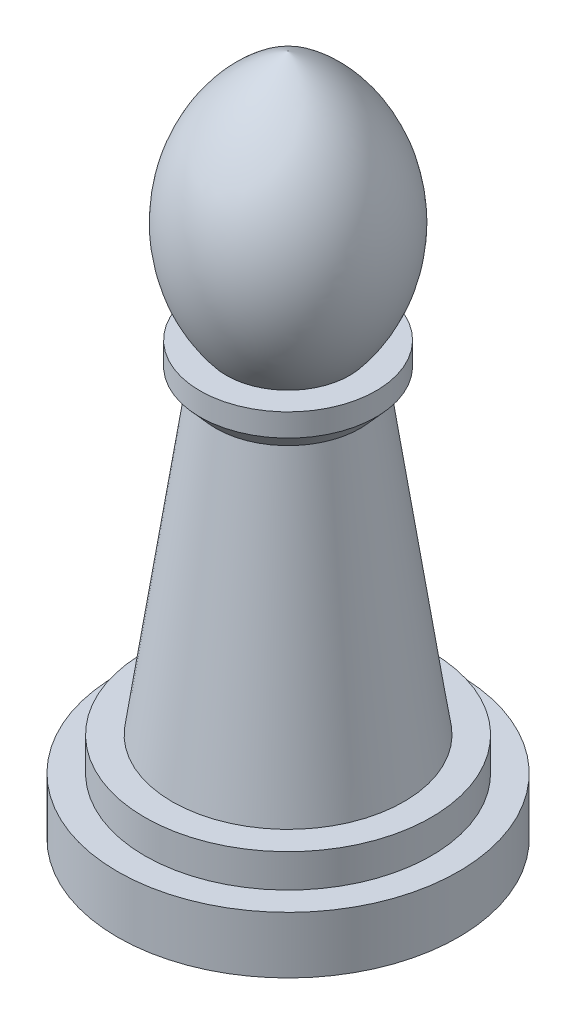
ISO-10303-21;
HEADER;
FILE_DESCRIPTION(('STEP AP214'),'2;1');
FILE_NAME('part.step','',(''),(''),'','','');
FILE_SCHEMA(('AUTOMOTIVE_DESIGN { 1 0 10303 214 1 1 1 1 }'));
ENDSEC;
DATA;
#1=APPLICATION_CONTEXT('core data for automotive mechanical design processes');
#2=APPLICATION_PROTOCOL_DEFINITION('international standard','automotive_design',2000,#1);
#3=PRODUCT_CONTEXT('',#1,'mechanical');
#4=PRODUCT('Part','Part','',(#3));
#5=PRODUCT_RELATED_PRODUCT_CATEGORY('part','',(#4));
#6=PRODUCT_DEFINITION_FORMATION('','',#4);
#7=PRODUCT_DEFINITION_CONTEXT('part definition',#1,'design');
#8=PRODUCT_DEFINITION('design','',#6,#7);
#9=PRODUCT_DEFINITION_SHAPE('','',#8);
#10=(LENGTH_UNIT() NAMED_UNIT(*) SI_UNIT(.MILLI.,.METRE.));
#11=(NAMED_UNIT(*) PLANE_ANGLE_UNIT() SI_UNIT($,.RADIAN.));
#12=(NAMED_UNIT(*) SI_UNIT($,.STERADIAN.) SOLID_ANGLE_UNIT());
#13=UNCERTAINTY_MEASURE_WITH_UNIT(LENGTH_MEASURE(1.E-05),#10,'distance_accuracy_value','');
#14=(GEOMETRIC_REPRESENTATION_CONTEXT(3) GLOBAL_UNCERTAINTY_ASSIGNED_CONTEXT((#13)) GLOBAL_UNIT_ASSIGNED_CONTEXT((#10,
#11,#12)) REPRESENTATION_CONTEXT('',''));
#15=CARTESIAN_POINT('',(0.,0.,0.));
#16=DIRECTION('',(0.,0.,1.));
#17=DIRECTION('',(1.,0.,0.));
#18=AXIS2_PLACEMENT_3D('',#15,#16,#17);
#19=CARTESIAN_POINT('',(0.,0.,0.));
#20=DIRECTION('',(0.,-1.,0.));
#21=DIRECTION('',(0.,0.,-1.));
#22=AXIS2_PLACEMENT_3D('',#19,#20,#21);
#23=PLANE('',#22);
#24=CARTESIAN_POINT('',(0.,0.,0.));
#25=DIRECTION('',(0.,1.,0.));
#26=DIRECTION('',(0.,0.,1.));
#27=AXIS2_PLACEMENT_3D('',#24,#25,#26);
#28=CIRCLE('',#27,9.525);
#29=CARTESIAN_POINT('',(0.,0.,9.525));
#30=VERTEX_POINT('',#29);
#31=EDGE_CURVE('E11',#30,#30,#28,.T.);
#32=ORIENTED_EDGE('',*,*,#31,.F.);
#33=EDGE_LOOP('',(#32));
#34=FACE_BOUND('',#33,.T.);
#35=ADVANCED_FACE('F43',(#34),#23,.T.);
#36=CARTESIAN_POINT('',(0.,38.1,0.));
#37=DIRECTION('',(0.,1.,0.));
#38=DIRECTION('',(0.,0.,1.));
#39=AXIS2_PLACEMENT_3D('',#36,#37,#38);
#40=CYLINDRICAL_SURFACE('',#39,9.525);
#41=ORIENTED_EDGE('',*,*,#31,.T.);
#42=EDGE_LOOP('',(#41));
#43=FACE_BOUND('',#42,.T.);
#44=CARTESIAN_POINT('',(0.,3.175,0.));
#45=DIRECTION('',(0.,1.,0.));
#46=DIRECTION('',(0.,0.,1.));
#47=AXIS2_PLACEMENT_3D('',#44,#45,#46);
#48=CIRCLE('',#47,9.525);
#49=CARTESIAN_POINT('',(0.,3.175,9.525));
#50=VERTEX_POINT('',#49);
#51=EDGE_CURVE('E49',#50,#50,#48,.T.);
#52=ORIENTED_EDGE('',*,*,#51,.F.);
#53=EDGE_LOOP('',(#52));
#54=FACE_BOUND('',#53,.T.);
#55=ADVANCED_FACE('F65',(#43,#54),#40,.T.);
#56=CARTESIAN_POINT('',(-8.001,3.175,0.));
#57=DIRECTION('',(0.,1.,0.));
#58=DIRECTION('',(0.,0.,1.));
#59=AXIS2_PLACEMENT_3D('',#56,#57,#58);
#60=PLANE('',#59);
#61=ORIENTED_EDGE('',*,*,#51,.T.);
#62=EDGE_LOOP('',(#61));
#63=FACE_BOUND('',#62,.T.);
#64=CARTESIAN_POINT('',(0.,3.175,0.));
#65=DIRECTION('',(0.,1.,0.));
#66=DIRECTION('',(0.,0.,1.));
#67=AXIS2_PLACEMENT_3D('',#64,#65,#66);
#68=CIRCLE('',#67,8.001);
#69=CARTESIAN_POINT('',(0.,3.175,8.001));
#70=VERTEX_POINT('',#69);
#71=EDGE_CURVE('E77',#70,#70,#68,.T.);
#72=ORIENTED_EDGE('',*,*,#71,.F.);
#73=EDGE_LOOP('',(#72));
#74=FACE_BOUND('',#73,.T.);
#75=ADVANCED_FACE('F70',(#63,#74),#60,.T.);
#76=CARTESIAN_POINT('',(0.,38.1,0.));
#77=DIRECTION('',(0.,1.,0.));
#78=DIRECTION('',(0.,0.,1.));
#79=AXIS2_PLACEMENT_3D('',#76,#77,#78);
#80=CYLINDRICAL_SURFACE('',#79,8.001);
#81=ORIENTED_EDGE('',*,*,#71,.T.);
#82=EDGE_LOOP('',(#81));
#83=FACE_BOUND('',#82,.T.);
#84=CARTESIAN_POINT('',(0.,5.03366229278283,0.));
#85=DIRECTION('',(0.,1.,0.));
#86=DIRECTION('',(0.,0.,1.));
#87=AXIS2_PLACEMENT_3D('',#84,#85,#86);
#88=CIRCLE('',#87,8.001);
#89=CARTESIAN_POINT('',(0.,5.03366229278283,8.001));
#90=VERTEX_POINT('',#89);
#91=EDGE_CURVE('E79',#90,#90,#88,.T.);
#92=ORIENTED_EDGE('',*,*,#91,.F.);
#93=EDGE_LOOP('',(#92));
#94=FACE_BOUND('',#93,.T.);
#95=ADVANCED_FACE('F118',(#83,#94),#80,.T.);
#96=CARTESIAN_POINT('',(-6.477,5.03366229278283,0.));
#97=DIRECTION('',(0.,1.,0.));
#98=DIRECTION('',(0.,0.,1.));
#99=AXIS2_PLACEMENT_3D('',#96,#97,#98);
#100=PLANE('',#99);
#101=ORIENTED_EDGE('',*,*,#91,.T.);
#102=EDGE_LOOP('',(#101));
#103=FACE_BOUND('',#102,.T.);
#104=CARTESIAN_POINT('',(0.,5.03366229278283,0.));
#105=DIRECTION('',(0.,1.,0.));
#106=DIRECTION('',(0.,0.,1.));
#107=AXIS2_PLACEMENT_3D('',#104,#105,#106);
#108=CIRCLE('',#107,6.477);
#109=CARTESIAN_POINT('',(0.,5.03366229278283,6.477));
#110=VERTEX_POINT('',#109);
#111=EDGE_CURVE('E84',#110,#110,#108,.T.);
#112=ORIENTED_EDGE('',*,*,#111,.F.);
#113=EDGE_LOOP('',(#112));
#114=FACE_BOUND('',#113,.T.);
#115=ADVANCED_FACE('F114',(#103,#114),#100,.T.);
#116=CARTESIAN_POINT('',(0.,21.8738622927828,0.));
#117=DIRECTION('',(0.,-1.,0.));
#118=DIRECTION('',(0.,0.,-1.));
#119=AXIS2_PLACEMENT_3D('',#116,#117,#118);
#120=CONICAL_SURFACE('',#119,4.0386,0.143796988986842);
#121=ORIENTED_EDGE('',*,*,#111,.T.);
#122=EDGE_LOOP('',(#121));
#123=FACE_BOUND('',#122,.T.);
#124=CARTESIAN_POINT('',(0.,21.8738622927828,0.));
#125=DIRECTION('',(0.,1.,0.));
#126=DIRECTION('',(0.,0.,1.));
#127=AXIS2_PLACEMENT_3D('',#124,#125,#126);
#128=CIRCLE('',#127,4.0386);
#129=CARTESIAN_POINT('',(0.,21.8738622927828,4.0386));
#130=VERTEX_POINT('',#129);
#131=EDGE_CURVE('E87',#130,#130,#128,.T.);
#132=ORIENTED_EDGE('',*,*,#131,.F.);
#133=EDGE_LOOP('',(#132));
#134=FACE_BOUND('',#133,.T.);
#135=ADVANCED_FACE('F108',(#123,#134),#120,.T.);
#136=CARTESIAN_POINT('',(0.,22.86,0.));
#137=DIRECTION('',(0.,1.,0.));
#138=DIRECTION('',(0.,0.,1.));
#139=AXIS2_PLACEMENT_3D('',#136,#137,#138);
#140=CONICAL_SURFACE('',#139,4.91910297712495,0.728867637010325);
#141=ORIENTED_EDGE('',*,*,#131,.T.);
#142=EDGE_LOOP('',(#141));
#143=FACE_BOUND('',#142,.T.);
#144=CARTESIAN_POINT('',(0.,22.86,0.));
#145=DIRECTION('',(0.,1.,0.));
#146=DIRECTION('',(0.,0.,1.));
#147=AXIS2_PLACEMENT_3D('',#144,#145,#146);
#148=CIRCLE('',#147,4.91910297712495);
#149=CARTESIAN_POINT('',(0.,22.86,4.91910297712495));
#150=VERTEX_POINT('',#149);
#151=EDGE_CURVE('E90',#150,#150,#148,.T.);
#152=ORIENTED_EDGE('',*,*,#151,.F.);
#153=EDGE_LOOP('',(#152));
#154=FACE_BOUND('',#153,.T.);
#155=ADVANCED_FACE('F102',(#143,#154),#140,.T.);
#156=CARTESIAN_POINT('',(0.,38.1,0.));
#157=DIRECTION('',(0.,1.,0.));
#158=DIRECTION('',(0.,0.,1.));
#159=AXIS2_PLACEMENT_3D('',#156,#157,#158);
#160=CYLINDRICAL_SURFACE('',#159,4.91910297712495);
#161=ORIENTED_EDGE('',*,*,#151,.T.);
#162=EDGE_LOOP('',(#161));
#163=FACE_BOUND('',#162,.T.);
#164=CARTESIAN_POINT('',(0.,24.13,0.));
#165=DIRECTION('',(0.,1.,0.));
#166=DIRECTION('',(0.,0.,1.));
#167=AXIS2_PLACEMENT_3D('',#164,#165,#166);
#168=CIRCLE('',#167,4.91910297712495);
#169=CARTESIAN_POINT('',(0.,24.13,4.91910297712495));
#170=VERTEX_POINT('',#169);
#171=EDGE_CURVE('E93',#170,#170,#168,.T.);
#172=ORIENTED_EDGE('',*,*,#171,.F.);
#173=EDGE_LOOP('',(#172));
#174=FACE_BOUND('',#173,.T.);
#175=ADVANCED_FACE('F60',(#163,#174),#160,.T.);
#176=CARTESIAN_POINT('',(-4.91910297712495,24.13,0.));
#177=DIRECTION('',(0.,1.,0.));
#178=DIRECTION('',(0.,0.,1.));
#179=AXIS2_PLACEMENT_3D('',#176,#177,#178);
#180=PLANE('',#179);
#181=ORIENTED_EDGE('',*,*,#171,.T.);
#182=EDGE_LOOP('',(#181));
#183=FACE_BOUND('',#182,.T.);
#184=CARTESIAN_POINT('',(0.,24.13,0.));
#185=DIRECTION('',(0.,1.,0.));
#186=DIRECTION('',(0.,0.,1.));
#187=AXIS2_PLACEMENT_3D('',#184,#185,#186);
#188=CIRCLE('',#187,3.4376425917559);
#189=CARTESIAN_POINT('',(0.,24.13,3.4376425917559));
#190=VERTEX_POINT('',#189);
#191=EDGE_CURVE('E96',#190,#190,#188,.T.);
#192=ORIENTED_EDGE('',*,*,#191,.F.);
#193=EDGE_LOOP('',(#192));
#194=FACE_BOUND('',#193,.T.);
#195=ADVANCED_FACE('F54',(#183,#194),#180,.T.);
#196=CARTESIAN_POINT('',(0.,29.8320247646928,-3.49497378573532));
#197=DIRECTION('',(-1.,0.,0.));
#198=DIRECTION('',(0.,0.,1.));
#199=AXIS2_PLACEMENT_3D('',#196,#197,#198);
#200=CIRCLE('',#199,8.97631640789416);
#201=TRIMMED_CURVE('',#200,(PARAMETER_VALUE(-1.17086508342639)),
(PARAMETER_VALUE(1.17086508342639)),.T.,.PARAMETER.);
#202=CARTESIAN_POINT('',(0.,29.8320247646928,0.));
#203=DIRECTION('',(0.,1.,0.));
#204=AXIS1_PLACEMENT('',#202,#203);
#205=SURFACE_OF_REVOLUTION('',#201,#204);
#206=ORIENTED_EDGE('',*,*,#191,.T.);
#207=EDGE_LOOP('',(#206));
#208=FACE_BOUND('',#207,.T.);
#209=CARTESIAN_POINT('',(0.,38.1,0.));
#210=VERTEX_POINT('',#209);
#211=VERTEX_LOOP('',#210);
#212=FACE_BOUND('',#211,.T.);
#213=ADVANCED_FACE('F52',(#208,#212),#205,.T.);
#214=CLOSED_SHELL('',(#35,#55,#75,#95,#115,#135,#155,#175,#195,#213));
#215=MANIFOLD_SOLID_BREP('B2',#214);
#216=ADVANCED_BREP_SHAPE_REPRESENTATION('',(#18,#215),#14);
#217=SHAPE_DEFINITION_REPRESENTATION(#9,#216);
ENDSEC;
END-ISO-10303-21;
